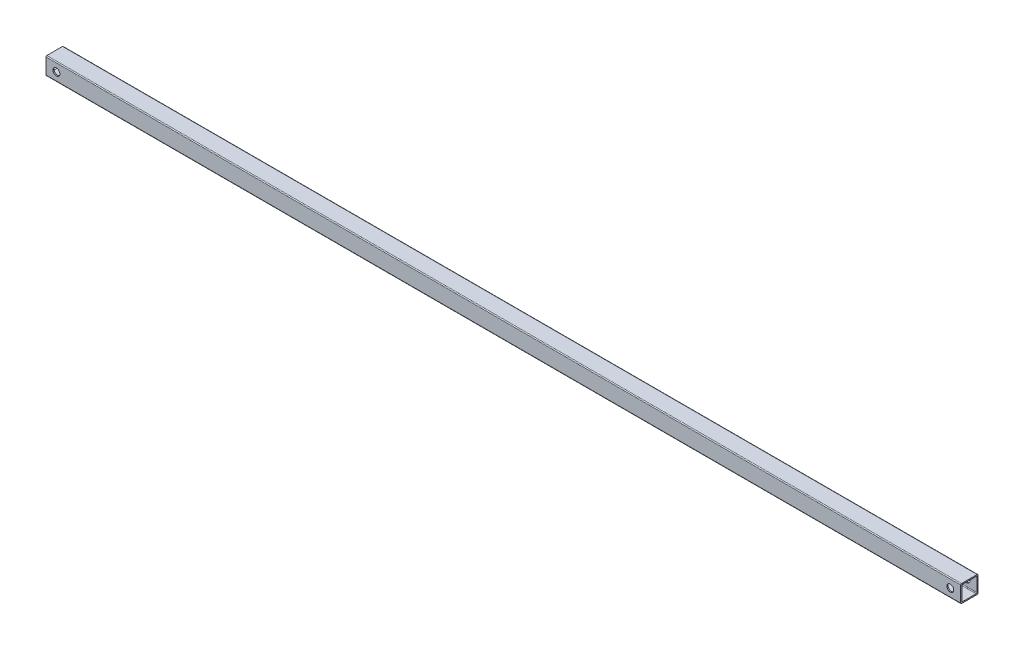
ISO-10303-21;
HEADER;
FILE_DESCRIPTION(('STEP AP214'),'2;1');
FILE_NAME('part.step','',(''),(''),'','','');
FILE_SCHEMA(('AUTOMOTIVE_DESIGN { 1 0 10303 214 1 1 1 1 }'));
ENDSEC;
DATA;
#1=APPLICATION_CONTEXT('core data for automotive mechanical design processes');
#2=APPLICATION_PROTOCOL_DEFINITION('international standard','automotive_design',2000,#1);
#3=PRODUCT_CONTEXT('',#1,'mechanical');
#4=PRODUCT('Part','Part','',(#3));
#5=PRODUCT_RELATED_PRODUCT_CATEGORY('part','',(#4));
#6=PRODUCT_DEFINITION_FORMATION('','',#4);
#7=PRODUCT_DEFINITION_CONTEXT('part definition',#1,'design');
#8=PRODUCT_DEFINITION('design','',#6,#7);
#9=PRODUCT_DEFINITION_SHAPE('','',#8);
#10=(LENGTH_UNIT() NAMED_UNIT(*) SI_UNIT(.MILLI.,.METRE.));
#11=(NAMED_UNIT(*) PLANE_ANGLE_UNIT() SI_UNIT($,.RADIAN.));
#12=(NAMED_UNIT(*) SI_UNIT($,.STERADIAN.) SOLID_ANGLE_UNIT());
#13=UNCERTAINTY_MEASURE_WITH_UNIT(LENGTH_MEASURE(1.E-05),#10,'distance_accuracy_value','');
#14=(GEOMETRIC_REPRESENTATION_CONTEXT(3) GLOBAL_UNCERTAINTY_ASSIGNED_CONTEXT((#13)) GLOBAL_UNIT_ASSIGNED_CONTEXT((#10,
#11,#12)) REPRESENTATION_CONTEXT('',''));
#15=CARTESIAN_POINT('',(0.,0.,0.));
#16=DIRECTION('',(0.,0.,1.));
#17=DIRECTION('',(1.,0.,0.));
#18=AXIS2_PLACEMENT_3D('',#15,#16,#17);
#19=CARTESIAN_POINT('',(838.2,-14.2875,-14.2875));
#20=DIRECTION('',(1.,0.,0.));
#21=DIRECTION('',(0.,0.,-1.));
#22=AXIS2_PLACEMENT_3D('',#19,#20,#21);
#23=PLANE('',#22);
#24=CARTESIAN_POINT('',(838.2,-14.2875,-14.2875));
#25=DIRECTION('',(1.,0.,0.));
#26=DIRECTION('',(0.,0.,-1.));
#27=AXIS2_PLACEMENT_3D('',#24,#25,#26);
#28=CIRCLE('',#27,1.5875);
#29=CARTESIAN_POINT('',(838.2,-15.875,-14.2875));
#30=VERTEX_POINT('',#29);
#31=CARTESIAN_POINT('',(838.2,-14.2875,-15.875));
#32=VERTEX_POINT('',#31);
#33=EDGE_CURVE('E167',#30,#32,#28,.T.);
#34=ORIENTED_EDGE('',*,*,#33,.T.);
#35=DIRECTION('',(0.,1.,0.));
#36=VECTOR('',#35,1.);
#37=CARTESIAN_POINT('',(838.2,-14.2875,-15.875));
#38=LINE('',#37,#36);
#39=CARTESIAN_POINT('',(838.2,14.2875,-15.875));
#40=VERTEX_POINT('',#39);
#41=EDGE_CURVE('E254',#32,#40,#38,.T.);
#42=ORIENTED_EDGE('',*,*,#41,.T.);
#43=CARTESIAN_POINT('',(838.2,14.2875,-14.2875));
#44=DIRECTION('',(1.,0.,0.));
#45=DIRECTION('',(0.,0.,-1.));
#46=AXIS2_PLACEMENT_3D('',#43,#44,#45);
#47=CIRCLE('',#46,1.5875);
#48=CARTESIAN_POINT('',(838.2,15.875,-14.2875));
#49=VERTEX_POINT('',#48);
#50=EDGE_CURVE('E256',#40,#49,#47,.T.);
#51=ORIENTED_EDGE('',*,*,#50,.T.);
#52=DIRECTION('',(0.,0.,1.));
#53=VECTOR('',#52,1.);
#54=CARTESIAN_POINT('',(838.2,15.875,-14.2875));
#55=LINE('',#54,#53);
#56=CARTESIAN_POINT('',(838.2,15.875,14.2875));
#57=VERTEX_POINT('',#56);
#58=EDGE_CURVE('E258',#49,#57,#55,.T.);
#59=ORIENTED_EDGE('',*,*,#58,.T.);
#60=CARTESIAN_POINT('',(838.2,14.2875,14.2875));
#61=DIRECTION('',(1.,0.,0.));
#62=DIRECTION('',(0.,0.,-1.));
#63=AXIS2_PLACEMENT_3D('',#60,#61,#62);
#64=CIRCLE('',#63,1.5875);
#65=CARTESIAN_POINT('',(838.2,14.2875,15.875));
#66=VERTEX_POINT('',#65);
#67=EDGE_CURVE('E260',#57,#66,#64,.T.);
#68=ORIENTED_EDGE('',*,*,#67,.T.);
#69=DIRECTION('',(0.,-1.,0.));
#70=VECTOR('',#69,1.);
#71=CARTESIAN_POINT('',(838.2,-14.2875,15.875));
#72=LINE('',#71,#70);
#73=CARTESIAN_POINT('',(838.2,-14.2875,15.875));
#74=VERTEX_POINT('',#73);
#75=EDGE_CURVE('E262',#66,#74,#72,.T.);
#76=ORIENTED_EDGE('',*,*,#75,.T.);
#77=CARTESIAN_POINT('',(838.2,-14.2875,14.2875));
#78=DIRECTION('',(1.,0.,0.));
#79=DIRECTION('',(0.,0.,-1.));
#80=AXIS2_PLACEMENT_3D('',#77,#78,#79);
#81=CIRCLE('',#80,1.5875);
#82=CARTESIAN_POINT('',(838.2,-15.875,14.2875));
#83=VERTEX_POINT('',#82);
#84=EDGE_CURVE('E264',#74,#83,#81,.T.);
#85=ORIENTED_EDGE('',*,*,#84,.T.);
#86=DIRECTION('',(0.,0.,-1.));
#87=VECTOR('',#86,1.);
#88=CARTESIAN_POINT('',(838.2,-15.875,-14.2875));
#89=LINE('',#88,#87);
#90=EDGE_CURVE('E66',#83,#30,#89,.T.);
#91=ORIENTED_EDGE('',*,*,#90,.T.);
#92=EDGE_LOOP('',(#34,#42,#51,#59,#68,#76,#85,#91));
#93=FACE_BOUND('',#92,.T.);
#94=DIRECTION('',(0.,0.,1.));
#95=VECTOR('',#94,1.);
#96=CARTESIAN_POINT('',(838.2,13.7668,-12.39012));
#97=LINE('',#96,#95);
#98=CARTESIAN_POINT('',(838.2,13.7668,-12.39012));
#99=VERTEX_POINT('',#98);
#100=CARTESIAN_POINT('',(838.2,13.7668,12.39012));
#101=VERTEX_POINT('',#100);
#102=EDGE_CURVE('E227',#99,#101,#97,.T.);
#103=ORIENTED_EDGE('',*,*,#102,.F.);
#104=CARTESIAN_POINT('',(838.2,12.39012,-12.39012));
#105=DIRECTION('',(1.,0.,0.));
#106=DIRECTION('',(0.,0.,-1.));
#107=AXIS2_PLACEMENT_3D('',#104,#105,#106);
#108=CIRCLE('',#107,1.37668);
#109=CARTESIAN_POINT('',(838.2,12.39012,-13.7668));
#110=VERTEX_POINT('',#109);
#111=EDGE_CURVE('E164',#110,#99,#108,.T.);
#112=ORIENTED_EDGE('',*,*,#111,.F.);
#113=DIRECTION('',(0.,1.,0.));
#114=VECTOR('',#113,1.);
#115=CARTESIAN_POINT('',(838.2,12.39012,-13.7668));
#116=LINE('',#115,#114);
#117=CARTESIAN_POINT('',(838.2,-12.39012,-13.7668));
#118=VERTEX_POINT('',#117);
#119=EDGE_CURVE('E239',#118,#110,#116,.T.);
#120=ORIENTED_EDGE('',*,*,#119,.F.);
#121=CARTESIAN_POINT('',(838.2,-12.39012,-12.39012));
#122=DIRECTION('',(1.,0.,0.));
#123=DIRECTION('',(0.,0.,-1.));
#124=AXIS2_PLACEMENT_3D('',#121,#122,#123);
#125=CIRCLE('',#124,1.37668);
#126=CARTESIAN_POINT('',(838.2,-13.7668,-12.39012));
#127=VERTEX_POINT('',#126);
#128=EDGE_CURVE('E237',#127,#118,#125,.T.);
#129=ORIENTED_EDGE('',*,*,#128,.F.);
#130=DIRECTION('',(0.,0.,-1.));
#131=VECTOR('',#130,1.);
#132=CARTESIAN_POINT('',(838.2,-13.7668,-12.39012));
#133=LINE('',#132,#131);
#134=CARTESIAN_POINT('',(838.2,-13.7668,12.39012));
#135=VERTEX_POINT('',#134);
#136=EDGE_CURVE('E235',#135,#127,#133,.T.);
#137=ORIENTED_EDGE('',*,*,#136,.F.);
#138=CARTESIAN_POINT('',(838.2,-12.39012,12.39012));
#139=DIRECTION('',(1.,0.,0.));
#140=DIRECTION('',(0.,0.,-1.));
#141=AXIS2_PLACEMENT_3D('',#138,#139,#140);
#142=CIRCLE('',#141,1.37668);
#143=CARTESIAN_POINT('',(838.2,-12.39012,13.7668));
#144=VERTEX_POINT('',#143);
#145=EDGE_CURVE('E233',#144,#135,#142,.T.);
#146=ORIENTED_EDGE('',*,*,#145,.F.);
#147=DIRECTION('',(0.,-1.,0.));
#148=VECTOR('',#147,1.);
#149=CARTESIAN_POINT('',(838.2,12.39012,13.7668));
#150=LINE('',#149,#148);
#151=CARTESIAN_POINT('',(838.2,12.39012,13.7668));
#152=VERTEX_POINT('',#151);
#153=EDGE_CURVE('E231',#152,#144,#150,.T.);
#154=ORIENTED_EDGE('',*,*,#153,.F.);
#155=CARTESIAN_POINT('',(838.2,12.39012,12.39012));
#156=DIRECTION('',(1.,0.,0.));
#157=DIRECTION('',(0.,0.,-1.));
#158=AXIS2_PLACEMENT_3D('',#155,#156,#157);
#159=CIRCLE('',#158,1.37668000000001);
#160=EDGE_CURVE('E229',#101,#152,#159,.T.);
#161=ORIENTED_EDGE('',*,*,#160,.F.);
#162=EDGE_LOOP('',(#103,#112,#120,#129,#137,#146,#154,#161));
#163=FACE_BOUND('',#162,.T.);
#164=ADVANCED_FACE('F41',(#93,#163),#23,.T.);
#165=CARTESIAN_POINT('',(838.2,-14.2875,-14.2875));
#166=DIRECTION('',(-1.,0.,0.));
#167=DIRECTION('',(0.,0.,1.));
#168=AXIS2_PLACEMENT_3D('',#165,#166,#167);
#169=CYLINDRICAL_SURFACE('',#168,1.5875);
#170=DIRECTION('',(-1.,0.,0.));
#171=VECTOR('',#170,1.);
#172=CARTESIAN_POINT('',(838.2,-15.875,-14.2875));
#173=LINE('',#172,#171);
#174=CARTESIAN_POINT('',(-838.2,-15.875,-14.2875));
#175=VERTEX_POINT('',#174);
#176=EDGE_CURVE('E267',#30,#175,#173,.T.);
#177=ORIENTED_EDGE('',*,*,#176,.T.);
#178=CARTESIAN_POINT('',(-838.2,-14.2875,-14.2875));
#179=DIRECTION('',(1.,0.,0.));
#180=DIRECTION('',(0.,0.,-1.));
#181=AXIS2_PLACEMENT_3D('',#178,#179,#180);
#182=CIRCLE('',#181,1.5875);
#183=CARTESIAN_POINT('',(-838.2,-14.2875,-15.875));
#184=VERTEX_POINT('',#183);
#185=EDGE_CURVE('E202',#175,#184,#182,.T.);
#186=ORIENTED_EDGE('',*,*,#185,.T.);
#187=DIRECTION('',(-1.,0.,0.));
#188=VECTOR('',#187,1.);
#189=CARTESIAN_POINT('',(838.2,-14.2875,-15.875));
#190=LINE('',#189,#188);
#191=EDGE_CURVE('E11',#32,#184,#190,.T.);
#192=ORIENTED_EDGE('',*,*,#191,.F.);
#193=ORIENTED_EDGE('',*,*,#33,.F.);
#194=EDGE_LOOP('',(#177,#186,#192,#193));
#195=FACE_BOUND('',#194,.T.);
#196=ADVANCED_FACE('F43',(#195),#169,.T.);
#197=CARTESIAN_POINT('',(838.2,-14.2875,-15.875));
#198=DIRECTION('',(0.,0.,1.));
#199=DIRECTION('',(1.,0.,0.));
#200=AXIS2_PLACEMENT_3D('',#197,#198,#199);
#201=PLANE('',#200);
#202=CARTESIAN_POINT('',(819.15,0.,-15.875));
#203=DIRECTION('',(0.,0.,1.));
#204=DIRECTION('',(1.,0.,0.));
#205=AXIS2_PLACEMENT_3D('',#202,#203,#204);
#206=CIRCLE('',#205,6.34999999999994);
#207=CARTESIAN_POINT('',(825.5,0.,-15.875));
#208=VERTEX_POINT('',#207);
#209=EDGE_CURVE('E282',#208,#208,#206,.T.);
#210=ORIENTED_EDGE('',*,*,#209,.T.);
#211=EDGE_LOOP('',(#210));
#212=FACE_BOUND('',#211,.T.);
#213=CARTESIAN_POINT('',(-819.15,0.,-15.875));
#214=DIRECTION('',(0.,0.,1.));
#215=DIRECTION('',(1.,0.,0.));
#216=AXIS2_PLACEMENT_3D('',#213,#214,#215);
#217=CIRCLE('',#216,6.34999999999994);
#218=CARTESIAN_POINT('',(-812.8,0.,-15.875));
#219=VERTEX_POINT('',#218);
#220=EDGE_CURVE('E297',#219,#219,#217,.T.);
#221=ORIENTED_EDGE('',*,*,#220,.T.);
#222=EDGE_LOOP('',(#221));
#223=FACE_BOUND('',#222,.T.);
#224=ORIENTED_EDGE('',*,*,#191,.T.);
#225=DIRECTION('',(0.,1.,0.));
#226=VECTOR('',#225,1.);
#227=CARTESIAN_POINT('',(-838.2,-14.2875,-15.875));
#228=LINE('',#227,#226);
#229=CARTESIAN_POINT('',(-838.2,14.2875,-15.875));
#230=VERTEX_POINT('',#229);
#231=EDGE_CURVE('E205',#184,#230,#228,.T.);
#232=ORIENTED_EDGE('',*,*,#231,.T.);
#233=DIRECTION('',(-1.,0.,0.));
#234=VECTOR('',#233,1.);
#235=CARTESIAN_POINT('',(838.2,14.2875,-15.875));
#236=LINE('',#235,#234);
#237=EDGE_CURVE('E50',#40,#230,#236,.T.);
#238=ORIENTED_EDGE('',*,*,#237,.F.);
#239=ORIENTED_EDGE('',*,*,#41,.F.);
#240=EDGE_LOOP('',(#224,#232,#238,#239));
#241=FACE_BOUND('',#240,.T.);
#242=ADVANCED_FACE('F301',(#212,#223,#241),#201,.F.);
#243=CARTESIAN_POINT('',(838.2,14.2875,-14.2875));
#244=DIRECTION('',(-1.,0.,0.));
#245=DIRECTION('',(0.,0.,1.));
#246=AXIS2_PLACEMENT_3D('',#243,#244,#245);
#247=CYLINDRICAL_SURFACE('',#246,1.5875);
#248=ORIENTED_EDGE('',*,*,#237,.T.);
#249=CARTESIAN_POINT('',(-838.2,14.2875,-14.2875));
#250=DIRECTION('',(1.,0.,0.));
#251=DIRECTION('',(0.,0.,-1.));
#252=AXIS2_PLACEMENT_3D('',#249,#250,#251);
#253=CIRCLE('',#252,1.5875);
#254=CARTESIAN_POINT('',(-838.2,15.875,-14.2875));
#255=VERTEX_POINT('',#254);
#256=EDGE_CURVE('E208',#230,#255,#253,.T.);
#257=ORIENTED_EDGE('',*,*,#256,.T.);
#258=DIRECTION('',(-1.,0.,0.));
#259=VECTOR('',#258,1.);
#260=CARTESIAN_POINT('',(838.2,15.875,-14.2875));
#261=LINE('',#260,#259);
#262=EDGE_CURVE('E277',#49,#255,#261,.T.);
#263=ORIENTED_EDGE('',*,*,#262,.F.);
#264=ORIENTED_EDGE('',*,*,#50,.F.);
#265=EDGE_LOOP('',(#248,#257,#263,#264));
#266=FACE_BOUND('',#265,.T.);
#267=ADVANCED_FACE('F349',(#266),#247,.T.);
#268=CARTESIAN_POINT('',(838.2,15.875,-14.2875));
#269=DIRECTION('',(0.,-1.,0.));
#270=DIRECTION('',(0.,0.,-1.));
#271=AXIS2_PLACEMENT_3D('',#268,#269,#270);
#272=PLANE('',#271);
#273=ORIENTED_EDGE('',*,*,#262,.T.);
#274=DIRECTION('',(0.,0.,1.));
#275=VECTOR('',#274,1.);
#276=CARTESIAN_POINT('',(-838.2,15.875,-14.2875));
#277=LINE('',#276,#275);
#278=CARTESIAN_POINT('',(-838.2,15.875,14.2875));
#279=VERTEX_POINT('',#278);
#280=EDGE_CURVE('E211',#255,#279,#277,.T.);
#281=ORIENTED_EDGE('',*,*,#280,.T.);
#282=DIRECTION('',(-1.,0.,0.));
#283=VECTOR('',#282,1.);
#284=CARTESIAN_POINT('',(838.2,15.875,14.2875));
#285=LINE('',#284,#283);
#286=EDGE_CURVE('E275',#57,#279,#285,.T.);
#287=ORIENTED_EDGE('',*,*,#286,.F.);
#288=ORIENTED_EDGE('',*,*,#58,.F.);
#289=EDGE_LOOP('',(#273,#281,#287,#288));
#290=FACE_BOUND('',#289,.T.);
#291=ADVANCED_FACE('F345',(#290),#272,.F.);
#292=CARTESIAN_POINT('',(838.2,14.2875,14.2875));
#293=DIRECTION('',(-1.,0.,0.));
#294=DIRECTION('',(0.,0.,1.));
#295=AXIS2_PLACEMENT_3D('',#292,#293,#294);
#296=CYLINDRICAL_SURFACE('',#295,1.5875);
#297=ORIENTED_EDGE('',*,*,#286,.T.);
#298=CARTESIAN_POINT('',(-838.2,14.2875,14.2875));
#299=DIRECTION('',(1.,0.,0.));
#300=DIRECTION('',(0.,0.,-1.));
#301=AXIS2_PLACEMENT_3D('',#298,#299,#300);
#302=CIRCLE('',#301,1.5875);
#303=CARTESIAN_POINT('',(-838.2,14.2875,15.875));
#304=VERTEX_POINT('',#303);
#305=EDGE_CURVE('E214',#279,#304,#302,.T.);
#306=ORIENTED_EDGE('',*,*,#305,.T.);
#307=DIRECTION('',(-1.,0.,0.));
#308=VECTOR('',#307,1.);
#309=CARTESIAN_POINT('',(838.2,14.2875,15.875));
#310=LINE('',#309,#308);
#311=EDGE_CURVE('E273',#66,#304,#310,.T.);
#312=ORIENTED_EDGE('',*,*,#311,.F.);
#313=ORIENTED_EDGE('',*,*,#67,.F.);
#314=EDGE_LOOP('',(#297,#306,#312,#313));
#315=FACE_BOUND('',#314,.T.);
#316=ADVANCED_FACE('F341',(#315),#296,.T.);
#317=CARTESIAN_POINT('',(838.2,-14.2875,15.875));
#318=DIRECTION('',(0.,0.,-1.));
#319=DIRECTION('',(-1.,0.,0.));
#320=AXIS2_PLACEMENT_3D('',#317,#318,#319);
#321=PLANE('',#320);
#322=CARTESIAN_POINT('',(819.15,0.,15.875));
#323=DIRECTION('',(0.,0.,1.));
#324=DIRECTION('',(1.,0.,0.));
#325=AXIS2_PLACEMENT_3D('',#322,#323,#324);
#326=CIRCLE('',#325,6.34999999999994);
#327=CARTESIAN_POINT('',(825.5,0.,15.875));
#328=VERTEX_POINT('',#327);
#329=EDGE_CURVE('E287',#328,#328,#326,.T.);
#330=ORIENTED_EDGE('',*,*,#329,.F.);
#331=EDGE_LOOP('',(#330));
#332=FACE_BOUND('',#331,.T.);
#333=CARTESIAN_POINT('',(-819.15,0.,15.875));
#334=DIRECTION('',(0.,0.,1.));
#335=DIRECTION('',(1.,0.,0.));
#336=AXIS2_PLACEMENT_3D('',#333,#334,#335);
#337=CIRCLE('',#336,6.34999999999994);
#338=CARTESIAN_POINT('',(-812.8,0.,15.875));
#339=VERTEX_POINT('',#338);
#340=EDGE_CURVE('E292',#339,#339,#337,.T.);
#341=ORIENTED_EDGE('',*,*,#340,.F.);
#342=EDGE_LOOP('',(#341));
#343=FACE_BOUND('',#342,.T.);
#344=ORIENTED_EDGE('',*,*,#311,.T.);
#345=DIRECTION('',(0.,-1.,0.));
#346=VECTOR('',#345,1.);
#347=CARTESIAN_POINT('',(-838.2,-14.2875,15.875));
#348=LINE('',#347,#346);
#349=CARTESIAN_POINT('',(-838.2,-14.2875,15.875));
#350=VERTEX_POINT('',#349);
#351=EDGE_CURVE('E217',#304,#350,#348,.T.);
#352=ORIENTED_EDGE('',*,*,#351,.T.);
#353=DIRECTION('',(-1.,0.,0.));
#354=VECTOR('',#353,1.);
#355=CARTESIAN_POINT('',(838.2,-14.2875,15.875));
#356=LINE('',#355,#354);
#357=EDGE_CURVE('E271',#74,#350,#356,.T.);
#358=ORIENTED_EDGE('',*,*,#357,.F.);
#359=ORIENTED_EDGE('',*,*,#75,.F.);
#360=EDGE_LOOP('',(#344,#352,#358,#359));
#361=FACE_BOUND('',#360,.T.);
#362=ADVANCED_FACE('F337',(#332,#343,#361),#321,.F.);
#363=CARTESIAN_POINT('',(838.2,-14.2875,14.2875));
#364=DIRECTION('',(-1.,0.,0.));
#365=DIRECTION('',(0.,0.,1.));
#366=AXIS2_PLACEMENT_3D('',#363,#364,#365);
#367=CYLINDRICAL_SURFACE('',#366,1.5875);
#368=ORIENTED_EDGE('',*,*,#357,.T.);
#369=CARTESIAN_POINT('',(-838.2,-14.2875,14.2875));
#370=DIRECTION('',(1.,0.,0.));
#371=DIRECTION('',(0.,0.,-1.));
#372=AXIS2_PLACEMENT_3D('',#369,#370,#371);
#373=CIRCLE('',#372,1.5875);
#374=CARTESIAN_POINT('',(-838.2,-15.875,14.2875));
#375=VERTEX_POINT('',#374);
#376=EDGE_CURVE('E220',#350,#375,#373,.T.);
#377=ORIENTED_EDGE('',*,*,#376,.T.);
#378=DIRECTION('',(-1.,0.,0.));
#379=VECTOR('',#378,1.);
#380=CARTESIAN_POINT('',(838.2,-15.875,14.2875));
#381=LINE('',#380,#379);
#382=EDGE_CURVE('E269',#83,#375,#381,.T.);
#383=ORIENTED_EDGE('',*,*,#382,.F.);
#384=ORIENTED_EDGE('',*,*,#84,.F.);
#385=EDGE_LOOP('',(#368,#377,#383,#384));
#386=FACE_BOUND('',#385,.T.);
#387=ADVANCED_FACE('F333',(#386),#367,.T.);
#388=CARTESIAN_POINT('',(838.2,-15.875,-14.2875));
#389=DIRECTION('',(0.,1.,0.));
#390=DIRECTION('',(0.,0.,1.));
#391=AXIS2_PLACEMENT_3D('',#388,#389,#390);
#392=PLANE('',#391);
#393=ORIENTED_EDGE('',*,*,#382,.T.);
#394=DIRECTION('',(0.,0.,-1.));
#395=VECTOR('',#394,1.);
#396=CARTESIAN_POINT('',(-838.2,-15.875,-14.2875));
#397=LINE('',#396,#395);
#398=EDGE_CURVE('E223',#375,#175,#397,.T.);
#399=ORIENTED_EDGE('',*,*,#398,.T.);
#400=ORIENTED_EDGE('',*,*,#176,.F.);
#401=ORIENTED_EDGE('',*,*,#90,.F.);
#402=EDGE_LOOP('',(#393,#399,#400,#401));
#403=FACE_BOUND('',#402,.T.);
#404=ADVANCED_FACE('F330',(#403),#392,.F.);
#405=CARTESIAN_POINT('',(838.2,12.39012,-12.39012));
#406=DIRECTION('',(-1.,0.,0.));
#407=DIRECTION('',(0.,0.,1.));
#408=AXIS2_PLACEMENT_3D('',#405,#406,#407);
#409=CYLINDRICAL_SURFACE('',#408,1.37668);
#410=DIRECTION('',(-1.,0.,0.));
#411=VECTOR('',#410,1.);
#412=CARTESIAN_POINT('',(838.2,13.7668,-12.39012));
#413=LINE('',#412,#411);
#414=CARTESIAN_POINT('',(-838.2,13.7668,-12.39012));
#415=VERTEX_POINT('',#414);
#416=EDGE_CURVE('E156',#99,#415,#413,.T.);
#417=ORIENTED_EDGE('',*,*,#416,.T.);
#418=CARTESIAN_POINT('',(-838.2,12.39012,-12.39012));
#419=DIRECTION('',(1.,0.,0.));
#420=DIRECTION('',(0.,0.,-1.));
#421=AXIS2_PLACEMENT_3D('',#418,#419,#420);
#422=CIRCLE('',#421,1.37668);
#423=CARTESIAN_POINT('',(-838.2,12.39012,-13.7668));
#424=VERTEX_POINT('',#423);
#425=EDGE_CURVE('E161',#424,#415,#422,.T.);
#426=ORIENTED_EDGE('',*,*,#425,.F.);
#427=DIRECTION('',(-1.,0.,0.));
#428=VECTOR('',#427,1.);
#429=CARTESIAN_POINT('',(838.2,12.39012,-13.7668));
#430=LINE('',#429,#428);
#431=EDGE_CURVE('E241',#110,#424,#430,.T.);
#432=ORIENTED_EDGE('',*,*,#431,.F.);
#433=ORIENTED_EDGE('',*,*,#111,.T.);
#434=EDGE_LOOP('',(#417,#426,#432,#433));
#435=FACE_BOUND('',#434,.T.);
#436=ADVANCED_FACE('F158',(#435),#409,.F.);
#437=CARTESIAN_POINT('',(838.2,13.7668,-12.39012));
#438=DIRECTION('',(0.,-1.,0.));
#439=DIRECTION('',(0.,0.,-1.));
#440=AXIS2_PLACEMENT_3D('',#437,#438,#439);
#441=PLANE('',#440);
#442=DIRECTION('',(-1.,0.,0.));
#443=VECTOR('',#442,1.);
#444=CARTESIAN_POINT('',(838.2,13.7668,12.39012));
#445=LINE('',#444,#443);
#446=CARTESIAN_POINT('',(-838.2,13.7668,12.39012));
#447=VERTEX_POINT('',#446);
#448=EDGE_CURVE('E168',#101,#447,#445,.T.);
#449=ORIENTED_EDGE('',*,*,#448,.T.);
#450=DIRECTION('',(0.,0.,1.));
#451=VECTOR('',#450,1.);
#452=CARTESIAN_POINT('',(-838.2,13.7668,-12.39012));
#453=LINE('',#452,#451);
#454=EDGE_CURVE('E171',#415,#447,#453,.T.);
#455=ORIENTED_EDGE('',*,*,#454,.F.);
#456=ORIENTED_EDGE('',*,*,#416,.F.);
#457=ORIENTED_EDGE('',*,*,#102,.T.);
#458=EDGE_LOOP('',(#449,#455,#456,#457));
#459=FACE_BOUND('',#458,.T.);
#460=ADVANCED_FACE('F172',(#459),#441,.T.);
#461=CARTESIAN_POINT('',(838.2,12.39012,12.39012));
#462=DIRECTION('',(-1.,0.,0.));
#463=DIRECTION('',(0.,0.,1.));
#464=AXIS2_PLACEMENT_3D('',#461,#462,#463);
#465=CYLINDRICAL_SURFACE('',#464,1.37668000000001);
#466=DIRECTION('',(-1.,0.,0.));
#467=VECTOR('',#466,1.);
#468=CARTESIAN_POINT('',(838.2,12.39012,13.7668));
#469=LINE('',#468,#467);
#470=CARTESIAN_POINT('',(-838.2,12.39012,13.7668));
#471=VERTEX_POINT('',#470);
#472=EDGE_CURVE('E250',#152,#471,#469,.T.);
#473=ORIENTED_EDGE('',*,*,#472,.T.);
#474=CARTESIAN_POINT('',(-838.2,12.39012,12.39012));
#475=DIRECTION('',(1.,0.,0.));
#476=DIRECTION('',(0.,0.,-1.));
#477=AXIS2_PLACEMENT_3D('',#474,#475,#476);
#478=CIRCLE('',#477,1.37668000000001);
#479=EDGE_CURVE('E177',#447,#471,#478,.T.);
#480=ORIENTED_EDGE('',*,*,#479,.F.);
#481=ORIENTED_EDGE('',*,*,#448,.F.);
#482=ORIENTED_EDGE('',*,*,#160,.T.);
#483=EDGE_LOOP('',(#473,#480,#481,#482));
#484=FACE_BOUND('',#483,.T.);
#485=ADVANCED_FACE('F393',(#484),#465,.F.);
#486=CARTESIAN_POINT('',(838.2,12.39012,13.7668));
#487=DIRECTION('',(0.,0.,-1.));
#488=DIRECTION('',(0.,1.,0.));
#489=AXIS2_PLACEMENT_3D('',#486,#487,#488);
#490=PLANE('',#489);
#491=CARTESIAN_POINT('',(819.15,0.,13.7668));
#492=DIRECTION('',(0.,0.,-1.));
#493=DIRECTION('',(0.,1.,0.));
#494=AXIS2_PLACEMENT_3D('',#491,#492,#493);
#495=CIRCLE('',#494,6.34999999999994);
#496=CARTESIAN_POINT('',(819.15,6.34999999999994,13.7668));
#497=VERTEX_POINT('',#496);
#498=EDGE_CURVE('E183',#497,#497,#495,.T.);
#499=ORIENTED_EDGE('',*,*,#498,.F.);
#500=EDGE_LOOP('',(#499));
#501=FACE_BOUND('',#500,.T.);
#502=CARTESIAN_POINT('',(-819.15,0.,13.7668));
#503=DIRECTION('',(0.,0.,-1.));
#504=DIRECTION('',(0.,1.,0.));
#505=AXIS2_PLACEMENT_3D('',#502,#503,#504);
#506=CIRCLE('',#505,6.34999999999994);
#507=CARTESIAN_POINT('',(-819.15,6.34999999999994,13.7668));
#508=VERTEX_POINT('',#507);
#509=EDGE_CURVE('E281',#508,#508,#506,.T.);
#510=ORIENTED_EDGE('',*,*,#509,.F.);
#511=EDGE_LOOP('',(#510));
#512=FACE_BOUND('',#511,.T.);
#513=DIRECTION('',(-1.,0.,0.));
#514=VECTOR('',#513,1.);
#515=CARTESIAN_POINT('',(838.2,-12.39012,13.7668));
#516=LINE('',#515,#514);
#517=CARTESIAN_POINT('',(-838.2,-12.39012,13.7668));
#518=VERTEX_POINT('',#517);
#519=EDGE_CURVE('E248',#144,#518,#516,.T.);
#520=ORIENTED_EDGE('',*,*,#519,.T.);
#521=DIRECTION('',(0.,-1.,0.));
#522=VECTOR('',#521,1.);
#523=CARTESIAN_POINT('',(-838.2,12.39012,13.7668));
#524=LINE('',#523,#522);
#525=EDGE_CURVE('E190',#471,#518,#524,.T.);
#526=ORIENTED_EDGE('',*,*,#525,.F.);
#527=ORIENTED_EDGE('',*,*,#472,.F.);
#528=ORIENTED_EDGE('',*,*,#153,.T.);
#529=EDGE_LOOP('',(#520,#526,#527,#528));
#530=FACE_BOUND('',#529,.T.);
#531=ADVANCED_FACE('F399',(#501,#512,#530),#490,.T.);
#532=CARTESIAN_POINT('',(838.2,-12.39012,12.39012));
#533=DIRECTION('',(-1.,0.,0.));
#534=DIRECTION('',(0.,0.,1.));
#535=AXIS2_PLACEMENT_3D('',#532,#533,#534);
#536=CYLINDRICAL_SURFACE('',#535,1.37668);
#537=DIRECTION('',(-1.,0.,0.));
#538=VECTOR('',#537,1.);
#539=CARTESIAN_POINT('',(838.2,-13.7668,12.39012));
#540=LINE('',#539,#538);
#541=CARTESIAN_POINT('',(-838.2,-13.7668,12.39012));
#542=VERTEX_POINT('',#541);
#543=EDGE_CURVE('E246',#135,#542,#540,.T.);
#544=ORIENTED_EDGE('',*,*,#543,.T.);
#545=CARTESIAN_POINT('',(-838.2,-12.39012,12.39012));
#546=DIRECTION('',(1.,0.,0.));
#547=DIRECTION('',(0.,0.,-1.));
#548=AXIS2_PLACEMENT_3D('',#545,#546,#547);
#549=CIRCLE('',#548,1.37668);
#550=EDGE_CURVE('E193',#518,#542,#549,.T.);
#551=ORIENTED_EDGE('',*,*,#550,.F.);
#552=ORIENTED_EDGE('',*,*,#519,.F.);
#553=ORIENTED_EDGE('',*,*,#145,.T.);
#554=EDGE_LOOP('',(#544,#551,#552,#553));
#555=FACE_BOUND('',#554,.T.);
#556=ADVANCED_FACE('F407',(#555),#536,.F.);
#557=CARTESIAN_POINT('',(838.2,-13.7668,-12.39012));
#558=DIRECTION('',(0.,1.,0.));
#559=DIRECTION('',(0.,0.,1.));
#560=AXIS2_PLACEMENT_3D('',#557,#558,#559);
#561=PLANE('',#560);
#562=DIRECTION('',(-1.,0.,0.));
#563=VECTOR('',#562,1.);
#564=CARTESIAN_POINT('',(838.2,-13.7668,-12.39012));
#565=LINE('',#564,#563);
#566=CARTESIAN_POINT('',(-838.2,-13.7668,-12.39012));
#567=VERTEX_POINT('',#566);
#568=EDGE_CURVE('E244',#127,#567,#565,.T.);
#569=ORIENTED_EDGE('',*,*,#568,.T.);
#570=DIRECTION('',(0.,0.,-1.));
#571=VECTOR('',#570,1.);
#572=CARTESIAN_POINT('',(-838.2,-13.7668,-12.39012));
#573=LINE('',#572,#571);
#574=EDGE_CURVE('E196',#542,#567,#573,.T.);
#575=ORIENTED_EDGE('',*,*,#574,.F.);
#576=ORIENTED_EDGE('',*,*,#543,.F.);
#577=ORIENTED_EDGE('',*,*,#136,.T.);
#578=EDGE_LOOP('',(#569,#575,#576,#577));
#579=FACE_BOUND('',#578,.T.);
#580=ADVANCED_FACE('F415',(#579),#561,.T.);
#581=CARTESIAN_POINT('',(838.2,-12.39012,-12.39012));
#582=DIRECTION('',(-1.,0.,0.));
#583=DIRECTION('',(0.,0.,1.));
#584=AXIS2_PLACEMENT_3D('',#581,#582,#583);
#585=CYLINDRICAL_SURFACE('',#584,1.37668);
#586=DIRECTION('',(-1.,0.,0.));
#587=VECTOR('',#586,1.);
#588=CARTESIAN_POINT('',(838.2,-12.39012,-13.7668));
#589=LINE('',#588,#587);
#590=CARTESIAN_POINT('',(-838.2,-12.39012,-13.7668));
#591=VERTEX_POINT('',#590);
#592=EDGE_CURVE('E58',#118,#591,#589,.T.);
#593=ORIENTED_EDGE('',*,*,#592,.T.);
#594=CARTESIAN_POINT('',(-838.2,-12.39012,-12.39012));
#595=DIRECTION('',(1.,0.,0.));
#596=DIRECTION('',(0.,0.,-1.));
#597=AXIS2_PLACEMENT_3D('',#594,#595,#596);
#598=CIRCLE('',#597,1.37668);
#599=EDGE_CURVE('E199',#567,#591,#598,.T.);
#600=ORIENTED_EDGE('',*,*,#599,.F.);
#601=ORIENTED_EDGE('',*,*,#568,.F.);
#602=ORIENTED_EDGE('',*,*,#128,.T.);
#603=EDGE_LOOP('',(#593,#600,#601,#602));
#604=FACE_BOUND('',#603,.T.);
#605=ADVANCED_FACE('F423',(#604),#585,.F.);
#606=CARTESIAN_POINT('',(838.2,12.39012,-13.7668));
#607=DIRECTION('',(0.,0.,1.));
#608=DIRECTION('',(1.,0.,0.));
#609=AXIS2_PLACEMENT_3D('',#606,#607,#608);
#610=PLANE('',#609);
#611=CARTESIAN_POINT('',(819.15,0.,-13.7668));
#612=DIRECTION('',(0.,0.,1.));
#613=DIRECTION('',(1.,0.,0.));
#614=AXIS2_PLACEMENT_3D('',#611,#612,#613);
#615=CIRCLE('',#614,6.34999999999994);
#616=CARTESIAN_POINT('',(825.5,0.,-13.7668));
#617=VERTEX_POINT('',#616);
#618=EDGE_CURVE('E45',#617,#617,#615,.T.);
#619=ORIENTED_EDGE('',*,*,#618,.F.);
#620=EDGE_LOOP('',(#619));
#621=FACE_BOUND('',#620,.T.);
#622=CARTESIAN_POINT('',(-819.15,0.,-13.7668));
#623=DIRECTION('',(0.,0.,1.));
#624=DIRECTION('',(1.,0.,0.));
#625=AXIS2_PLACEMENT_3D('',#622,#623,#624);
#626=CIRCLE('',#625,6.34999999999994);
#627=CARTESIAN_POINT('',(-812.8,0.,-13.7668));
#628=VERTEX_POINT('',#627);
#629=EDGE_CURVE('E279',#628,#628,#626,.T.);
#630=ORIENTED_EDGE('',*,*,#629,.F.);
#631=EDGE_LOOP('',(#630));
#632=FACE_BOUND('',#631,.T.);
#633=ORIENTED_EDGE('',*,*,#431,.T.);
#634=DIRECTION('',(0.,1.,0.));
#635=VECTOR('',#634,1.);
#636=CARTESIAN_POINT('',(-838.2,12.39012,-13.7668));
#637=LINE('',#636,#635);
#638=EDGE_CURVE('E182',#591,#424,#637,.T.);
#639=ORIENTED_EDGE('',*,*,#638,.F.);
#640=ORIENTED_EDGE('',*,*,#592,.F.);
#641=ORIENTED_EDGE('',*,*,#119,.T.);
#642=EDGE_LOOP('',(#633,#639,#640,#641));
#643=FACE_BOUND('',#642,.T.);
#644=ADVANCED_FACE('F316',(#621,#632,#643),#610,.T.);
#645=CARTESIAN_POINT('',(-838.2,-14.2875,-14.2875));
#646=DIRECTION('',(1.,0.,0.));
#647=DIRECTION('',(0.,0.,-1.));
#648=AXIS2_PLACEMENT_3D('',#645,#646,#647);
#649=PLANE('',#648);
#650=ORIENTED_EDGE('',*,*,#638,.T.);
#651=ORIENTED_EDGE('',*,*,#425,.T.);
#652=ORIENTED_EDGE('',*,*,#454,.T.);
#653=ORIENTED_EDGE('',*,*,#479,.T.);
#654=ORIENTED_EDGE('',*,*,#525,.T.);
#655=ORIENTED_EDGE('',*,*,#550,.T.);
#656=ORIENTED_EDGE('',*,*,#574,.T.);
#657=ORIENTED_EDGE('',*,*,#599,.T.);
#658=EDGE_LOOP('',(#650,#651,#652,#653,#654,#655,#656,#657));
#659=FACE_BOUND('',#658,.T.);
#660=ORIENTED_EDGE('',*,*,#185,.F.);
#661=ORIENTED_EDGE('',*,*,#398,.F.);
#662=ORIENTED_EDGE('',*,*,#376,.F.);
#663=ORIENTED_EDGE('',*,*,#351,.F.);
#664=ORIENTED_EDGE('',*,*,#305,.F.);
#665=ORIENTED_EDGE('',*,*,#280,.F.);
#666=ORIENTED_EDGE('',*,*,#256,.F.);
#667=ORIENTED_EDGE('',*,*,#231,.F.);
#668=EDGE_LOOP('',(#660,#661,#662,#663,#664,#665,#666,#667));
#669=FACE_BOUND('',#668,.T.);
#670=ADVANCED_FACE('F179',(#659,#669),#649,.F.);
#671=CARTESIAN_POINT('',(-819.15,0.,-15.875));
#672=DIRECTION('',(0.,0.,1.));
#673=DIRECTION('',(1.,0.,0.));
#674=AXIS2_PLACEMENT_3D('',#671,#672,#673);
#675=CYLINDRICAL_SURFACE('',#674,6.34999999999994);
#676=ORIENTED_EDGE('',*,*,#629,.T.);
#677=EDGE_LOOP('',(#676));
#678=FACE_BOUND('',#677,.T.);
#679=ORIENTED_EDGE('',*,*,#220,.F.);
#680=EDGE_LOOP('',(#679));
#681=FACE_BOUND('',#680,.T.);
#682=ADVANCED_FACE('F304',(#678,#681),#675,.F.);
#683=CARTESIAN_POINT('',(819.15,0.,-15.875));
#684=DIRECTION('',(0.,0.,1.));
#685=DIRECTION('',(1.,0.,0.));
#686=AXIS2_PLACEMENT_3D('',#683,#684,#685);
#687=CYLINDRICAL_SURFACE('',#686,6.34999999999994);
#688=ORIENTED_EDGE('',*,*,#618,.T.);
#689=EDGE_LOOP('',(#688));
#690=FACE_BOUND('',#689,.T.);
#691=ORIENTED_EDGE('',*,*,#209,.F.);
#692=EDGE_LOOP('',(#691));
#693=FACE_BOUND('',#692,.T.);
#694=ADVANCED_FACE('F306',(#690,#693),#687,.F.);
#695=ORIENTED_EDGE('',*,*,#509,.T.);
#696=EDGE_LOOP('',(#695));
#697=FACE_BOUND('',#696,.T.);
#698=ORIENTED_EDGE('',*,*,#340,.T.);
#699=EDGE_LOOP('',(#698));
#700=FACE_BOUND('',#699,.T.);
#701=ADVANCED_FACE('F308',(#697,#700),#675,.F.);
#702=ORIENTED_EDGE('',*,*,#498,.T.);
#703=EDGE_LOOP('',(#702));
#704=FACE_BOUND('',#703,.T.);
#705=ORIENTED_EDGE('',*,*,#329,.T.);
#706=EDGE_LOOP('',(#705));
#707=FACE_BOUND('',#706,.T.);
#708=ADVANCED_FACE('F315',(#704,#707),#687,.F.);
#709=CLOSED_SHELL('',(#164,#196,#242,#267,#291,#316,#362,#387,#404,#436,#460,#485,#531,#556,
#580,#605,#644,#670,#682,#694,#701,#708));
#710=MANIFOLD_SOLID_BREP('B2',#709);
#711=ADVANCED_BREP_SHAPE_REPRESENTATION('',(#18,#710),#14);
#712=SHAPE_DEFINITION_REPRESENTATION(#9,#711);
ENDSEC;
END-ISO-10303-21;
